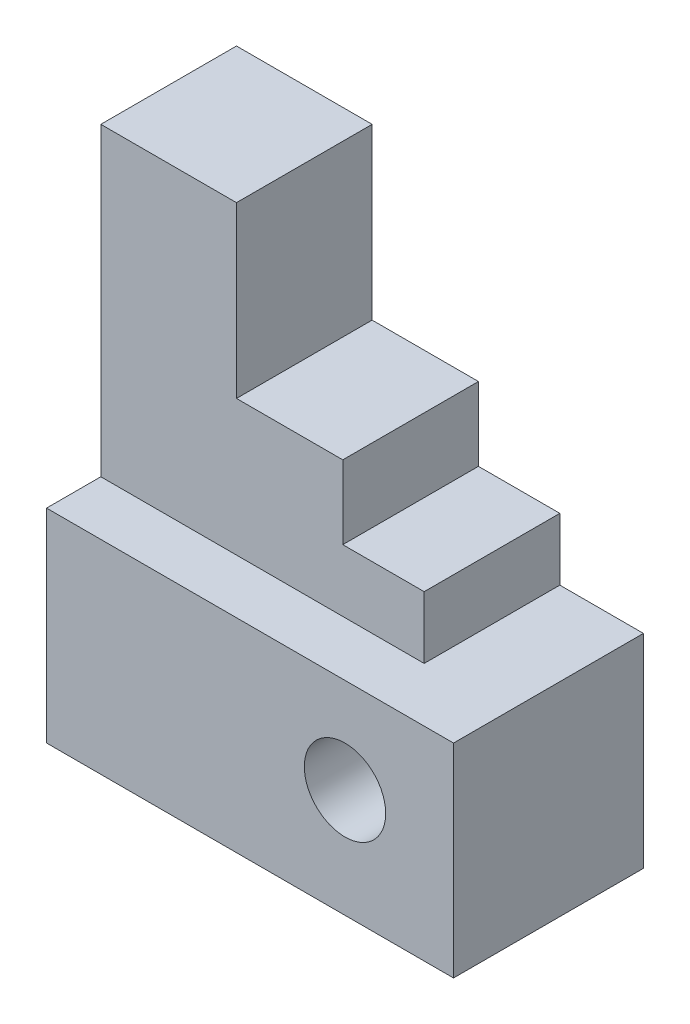
ISO-10303-21;
HEADER;
FILE_DESCRIPTION(('STEP AP214'),'2;1');
FILE_NAME('part.step','',(''),(''),'','','');
FILE_SCHEMA(('AUTOMOTIVE_DESIGN { 1 0 10303 214 1 1 1 1 }'));
ENDSEC;
DATA;
#1=APPLICATION_CONTEXT('core data for automotive mechanical design processes');
#2=APPLICATION_PROTOCOL_DEFINITION('international standard','automotive_design',2000,#1);
#3=PRODUCT_CONTEXT('',#1,'mechanical');
#4=PRODUCT('Part','Part','',(#3));
#5=PRODUCT_RELATED_PRODUCT_CATEGORY('part','',(#4));
#6=PRODUCT_DEFINITION_FORMATION('','',#4);
#7=PRODUCT_DEFINITION_CONTEXT('part definition',#1,'design');
#8=PRODUCT_DEFINITION('design','',#6,#7);
#9=PRODUCT_DEFINITION_SHAPE('','',#8);
#10=(LENGTH_UNIT() NAMED_UNIT(*) SI_UNIT(.MILLI.,.METRE.));
#11=(NAMED_UNIT(*) PLANE_ANGLE_UNIT() SI_UNIT($,.RADIAN.));
#12=(NAMED_UNIT(*) SI_UNIT($,.STERADIAN.) SOLID_ANGLE_UNIT());
#13=UNCERTAINTY_MEASURE_WITH_UNIT(LENGTH_MEASURE(1.E-05),#10,'distance_accuracy_value','');
#14=(GEOMETRIC_REPRESENTATION_CONTEXT(3) GLOBAL_UNCERTAINTY_ASSIGNED_CONTEXT((#13)) GLOBAL_UNIT_ASSIGNED_CONTEXT((#10,
#11,#12)) REPRESENTATION_CONTEXT('',''));
#15=CARTESIAN_POINT('',(0.,0.,0.));
#16=DIRECTION('',(0.,0.,1.));
#17=DIRECTION('',(1.,0.,0.));
#18=AXIS2_PLACEMENT_3D('',#15,#16,#17);
#19=CARTESIAN_POINT('',(0.,0.,28.));
#20=DIRECTION('',(0.,1.,0.));
#21=DIRECTION('',(0.,0.,1.));
#22=AXIS2_PLACEMENT_3D('',#19,#20,#21);
#23=PLANE('',#22);
#24=DIRECTION('',(1.,0.,0.));
#25=VECTOR('',#24,1.);
#26=CARTESIAN_POINT('',(0.,0.,0.));
#27=LINE('',#26,#25);
#28=CARTESIAN_POINT('',(0.,0.,0.));
#29=VERTEX_POINT('',#28);
#30=CARTESIAN_POINT('',(60.,0.,0.));
#31=VERTEX_POINT('',#30);
#32=EDGE_CURVE('E238',#29,#31,#27,.T.);
#33=ORIENTED_EDGE('',*,*,#32,.T.);
#34=DIRECTION('',(0.,0.,-1.));
#35=VECTOR('',#34,1.);
#36=CARTESIAN_POINT('',(60.,0.,28.));
#37=LINE('',#36,#35);
#38=CARTESIAN_POINT('',(60.,0.,28.));
#39=VERTEX_POINT('',#38);
#40=EDGE_CURVE('E11',#39,#31,#37,.T.);
#41=ORIENTED_EDGE('',*,*,#40,.F.);
#42=DIRECTION('',(1.,0.,0.));
#43=VECTOR('',#42,1.);
#44=CARTESIAN_POINT('',(0.,0.,28.));
#45=LINE('',#44,#43);
#46=CARTESIAN_POINT('',(0.,0.,28.));
#47=VERTEX_POINT('',#46);
#48=EDGE_CURVE('E218',#47,#39,#45,.T.);
#49=ORIENTED_EDGE('',*,*,#48,.F.);
#50=DIRECTION('',(0.,0.,-1.));
#51=VECTOR('',#50,1.);
#52=CARTESIAN_POINT('',(0.,0.,28.));
#53=LINE('',#52,#51);
#54=EDGE_CURVE('E234',#47,#29,#53,.T.);
#55=ORIENTED_EDGE('',*,*,#54,.T.);
#56=EDGE_LOOP('',(#33,#41,#49,#55));
#57=FACE_BOUND('',#56,.T.);
#58=ADVANCED_FACE('F45',(#57),#23,.F.);
#59=CARTESIAN_POINT('',(60.,0.,28.));
#60=DIRECTION('',(-1.,0.,0.));
#61=DIRECTION('',(0.,0.,1.));
#62=AXIS2_PLACEMENT_3D('',#59,#60,#61);
#63=PLANE('',#62);
#64=DIRECTION('',(0.,1.,0.));
#65=VECTOR('',#64,1.);
#66=CARTESIAN_POINT('',(60.,0.,0.));
#67=LINE('',#66,#65);
#68=CARTESIAN_POINT('',(60.,30.,0.));
#69=VERTEX_POINT('',#68);
#70=EDGE_CURVE('E242',#31,#69,#67,.T.);
#71=ORIENTED_EDGE('',*,*,#70,.T.);
#72=DIRECTION('',(0.,0.,-1.));
#73=VECTOR('',#72,1.);
#74=CARTESIAN_POINT('',(60.,30.,28.));
#75=LINE('',#74,#73);
#76=CARTESIAN_POINT('',(60.,30.,28.));
#77=VERTEX_POINT('',#76);
#78=EDGE_CURVE('E54',#77,#69,#75,.T.);
#79=ORIENTED_EDGE('',*,*,#78,.F.);
#80=DIRECTION('',(0.,1.,0.));
#81=VECTOR('',#80,1.);
#82=CARTESIAN_POINT('',(60.,0.,28.));
#83=LINE('',#82,#81);
#84=EDGE_CURVE('E223',#39,#77,#83,.T.);
#85=ORIENTED_EDGE('',*,*,#84,.F.);
#86=ORIENTED_EDGE('',*,*,#40,.T.);
#87=EDGE_LOOP('',(#71,#79,#85,#86));
#88=FACE_BOUND('',#87,.T.);
#89=ADVANCED_FACE('F259',(#88),#63,.F.);
#90=CARTESIAN_POINT('',(0.,30.,28.));
#91=DIRECTION('',(0.,1.,0.));
#92=DIRECTION('',(0.,0.,1.));
#93=AXIS2_PLACEMENT_3D('',#90,#91,#92);
#94=PLANE('',#93);
#95=DIRECTION('',(0.,0.,-1.));
#96=VECTOR('',#95,1.);
#97=CARTESIAN_POINT('',(47.6737293262179,30.,20.));
#98=LINE('',#97,#96);
#99=CARTESIAN_POINT('',(47.6737293262179,30.,20.));
#100=VERTEX_POINT('',#99);
#101=CARTESIAN_POINT('',(47.6737293262179,30.,0.));
#102=VERTEX_POINT('',#101);
#103=EDGE_CURVE('E199',#100,#102,#98,.T.);
#104=ORIENTED_EDGE('',*,*,#103,.F.);
#105=DIRECTION('',(1.,0.,0.));
#106=VECTOR('',#105,1.);
#107=CARTESIAN_POINT('',(0.,30.,20.));
#108=LINE('',#107,#106);
#109=CARTESIAN_POINT('',(0.,30.,20.));
#110=VERTEX_POINT('',#109);
#111=EDGE_CURVE('E61',#110,#100,#108,.T.);
#112=ORIENTED_EDGE('',*,*,#111,.F.);
#113=DIRECTION('',(0.,0.,-1.));
#114=VECTOR('',#113,1.);
#115=CARTESIAN_POINT('',(0.,30.,28.));
#116=LINE('',#115,#114);
#117=CARTESIAN_POINT('',(0.,30.,28.));
#118=VERTEX_POINT('',#117);
#119=EDGE_CURVE('E252',#118,#110,#116,.T.);
#120=ORIENTED_EDGE('',*,*,#119,.F.);
#121=DIRECTION('',(1.,0.,0.));
#122=VECTOR('',#121,1.);
#123=CARTESIAN_POINT('',(0.,30.,28.));
#124=LINE('',#123,#122);
#125=EDGE_CURVE('E226',#118,#77,#124,.T.);
#126=ORIENTED_EDGE('',*,*,#125,.T.);
#127=ORIENTED_EDGE('',*,*,#78,.T.);
#128=DIRECTION('',(1.,0.,0.));
#129=VECTOR('',#128,1.);
#130=CARTESIAN_POINT('',(0.,30.,0.));
#131=LINE('',#130,#129);
#132=EDGE_CURVE('E67',#102,#69,#131,.T.);
#133=ORIENTED_EDGE('',*,*,#132,.F.);
#134=EDGE_LOOP('',(#104,#112,#120,#126,#127,#133));
#135=FACE_BOUND('',#134,.T.);
#136=ADVANCED_FACE('F256',(#135),#94,.T.);
#137=CARTESIAN_POINT('',(44.,16.,28.));
#138=DIRECTION('',(0.,0.,-1.));
#139=DIRECTION('',(-1.,0.,0.));
#140=AXIS2_PLACEMENT_3D('',#137,#138,#139);
#141=CYLINDRICAL_SURFACE('',#140,6.);
#142=CARTESIAN_POINT('',(44.,16.,28.));
#143=DIRECTION('',(0.,0.,1.));
#144=DIRECTION('',(1.,0.,0.));
#145=AXIS2_PLACEMENT_3D('',#142,#143,#144);
#146=CIRCLE('',#145,6.);
#147=CARTESIAN_POINT('',(50.,16.,28.));
#148=VERTEX_POINT('',#147);
#149=EDGE_CURVE('E214',#148,#148,#146,.T.);
#150=ORIENTED_EDGE('',*,*,#149,.T.);
#151=EDGE_LOOP('',(#150));
#152=FACE_BOUND('',#151,.T.);
#153=CARTESIAN_POINT('',(44.,16.,0.));
#154=DIRECTION('',(0.,0.,1.));
#155=DIRECTION('',(1.,0.,0.));
#156=AXIS2_PLACEMENT_3D('',#153,#154,#155);
#157=CIRCLE('',#156,6.);
#158=CARTESIAN_POINT('',(50.,16.,0.));
#159=VERTEX_POINT('',#158);
#160=EDGE_CURVE('E139',#159,#159,#157,.T.);
#161=ORIENTED_EDGE('',*,*,#160,.F.);
#162=EDGE_LOOP('',(#161));
#163=FACE_BOUND('',#162,.T.);
#164=ADVANCED_FACE('F47',(#152,#163),#141,.F.);
#165=CARTESIAN_POINT('',(0.,0.,28.));
#166=DIRECTION('',(-1.,0.,0.));
#167=DIRECTION('',(0.,0.,1.));
#168=AXIS2_PLACEMENT_3D('',#165,#166,#167);
#169=PLANE('',#168);
#170=DIRECTION('',(0.,1.,0.));
#171=VECTOR('',#170,1.);
#172=CARTESIAN_POINT('',(0.,0.,0.));
#173=LINE('',#172,#171);
#174=CARTESIAN_POINT('',(0.,75.,0.));
#175=VERTEX_POINT('',#174);
#176=EDGE_CURVE('E219',#29,#175,#173,.T.);
#177=ORIENTED_EDGE('',*,*,#176,.F.);
#178=ORIENTED_EDGE('',*,*,#54,.F.);
#179=DIRECTION('',(0.,1.,0.));
#180=VECTOR('',#179,1.);
#181=CARTESIAN_POINT('',(0.,0.,28.));
#182=LINE('',#181,#180);
#183=EDGE_CURVE('E230',#47,#118,#182,.T.);
#184=ORIENTED_EDGE('',*,*,#183,.T.);
#185=ORIENTED_EDGE('',*,*,#119,.T.);
#186=DIRECTION('',(0.,1.,0.));
#187=VECTOR('',#186,1.);
#188=CARTESIAN_POINT('',(0.,0.,20.));
#189=LINE('',#188,#187);
#190=CARTESIAN_POINT('',(0.,75.,20.));
#191=VERTEX_POINT('',#190);
#192=EDGE_CURVE('E168',#110,#191,#189,.T.);
#193=ORIENTED_EDGE('',*,*,#192,.T.);
#194=DIRECTION('',(0.,0.,-1.));
#195=VECTOR('',#194,1.);
#196=CARTESIAN_POINT('',(0.,75.,20.));
#197=LINE('',#196,#195);
#198=EDGE_CURVE('E202',#191,#175,#197,.T.);
#199=ORIENTED_EDGE('',*,*,#198,.T.);
#200=EDGE_LOOP('',(#177,#178,#184,#185,#193,#199));
#201=FACE_BOUND('',#200,.T.);
#202=ADVANCED_FACE('F271',(#201),#169,.T.);
#203=CARTESIAN_POINT('',(0.,0.,28.));
#204=DIRECTION('',(0.,0.,1.));
#205=DIRECTION('',(1.,0.,0.));
#206=AXIS2_PLACEMENT_3D('',#203,#204,#205);
#207=PLANE('',#206);
#208=ORIENTED_EDGE('',*,*,#149,.F.);
#209=EDGE_LOOP('',(#208));
#210=FACE_BOUND('',#209,.T.);
#211=ORIENTED_EDGE('',*,*,#48,.T.);
#212=ORIENTED_EDGE('',*,*,#84,.T.);
#213=ORIENTED_EDGE('',*,*,#125,.F.);
#214=ORIENTED_EDGE('',*,*,#183,.F.);
#215=EDGE_LOOP('',(#211,#212,#213,#214));
#216=FACE_BOUND('',#215,.T.);
#217=ADVANCED_FACE('F275',(#210,#216),#207,.T.);
#218=CARTESIAN_POINT('',(0.,0.,0.));
#219=DIRECTION('',(0.,0.,1.));
#220=DIRECTION('',(1.,0.,0.));
#221=AXIS2_PLACEMENT_3D('',#218,#219,#220);
#222=PLANE('',#221);
#223=ORIENTED_EDGE('',*,*,#160,.T.);
#224=EDGE_LOOP('',(#223));
#225=FACE_BOUND('',#224,.T.);
#226=ORIENTED_EDGE('',*,*,#32,.F.);
#227=ORIENTED_EDGE('',*,*,#176,.T.);
#228=DIRECTION('',(1.,0.,0.));
#229=VECTOR('',#228,1.);
#230=CARTESIAN_POINT('',(0.,75.,0.));
#231=LINE('',#230,#229);
#232=CARTESIAN_POINT('',(20.,75.,0.));
#233=VERTEX_POINT('',#232);
#234=EDGE_CURVE('E190',#175,#233,#231,.T.);
#235=ORIENTED_EDGE('',*,*,#234,.T.);
#236=DIRECTION('',(0.,1.,0.));
#237=VECTOR('',#236,1.);
#238=CARTESIAN_POINT('',(20.,0.,0.));
#239=LINE('',#238,#237);
#240=CARTESIAN_POINT('',(20.,50.,0.));
#241=VERTEX_POINT('',#240);
#242=EDGE_CURVE('E186',#241,#233,#239,.T.);
#243=ORIENTED_EDGE('',*,*,#242,.F.);
#244=DIRECTION('',(1.,0.,0.));
#245=VECTOR('',#244,1.);
#246=CARTESIAN_POINT('',(0.,50.,0.));
#247=LINE('',#246,#245);
#248=CARTESIAN_POINT('',(35.6737293262179,50.,0.));
#249=VERTEX_POINT('',#248);
#250=EDGE_CURVE('E182',#241,#249,#247,.T.);
#251=ORIENTED_EDGE('',*,*,#250,.T.);
#252=DIRECTION('',(0.,-1.,0.));
#253=VECTOR('',#252,1.);
#254=CARTESIAN_POINT('',(35.6737293262179,0.,0.));
#255=LINE('',#254,#253);
#256=CARTESIAN_POINT('',(35.6737293262179,39.1665833998087,0.));
#257=VERTEX_POINT('',#256);
#258=EDGE_CURVE('E179',#249,#257,#255,.T.);
#259=ORIENTED_EDGE('',*,*,#258,.T.);
#260=DIRECTION('',(1.,0.,0.));
#261=VECTOR('',#260,1.);
#262=CARTESIAN_POINT('',(0.,39.1665833998087,0.));
#263=LINE('',#262,#261);
#264=CARTESIAN_POINT('',(47.6737293262179,39.1665833998087,0.));
#265=VERTEX_POINT('',#264);
#266=EDGE_CURVE('E133',#257,#265,#263,.T.);
#267=ORIENTED_EDGE('',*,*,#266,.T.);
#268=DIRECTION('',(0.,1.,0.));
#269=VECTOR('',#268,1.);
#270=CARTESIAN_POINT('',(47.6737293262179,0.,0.));
#271=LINE('',#270,#269);
#272=EDGE_CURVE('E152',#102,#265,#271,.T.);
#273=ORIENTED_EDGE('',*,*,#272,.F.);
#274=ORIENTED_EDGE('',*,*,#132,.T.);
#275=ORIENTED_EDGE('',*,*,#70,.F.);
#276=EDGE_LOOP('',(#226,#227,#235,#243,#251,#259,#267,#273,#274,#275));
#277=FACE_BOUND('',#276,.T.);
#278=ADVANCED_FACE('F263',(#225,#277),#222,.F.);
#279=CARTESIAN_POINT('',(0.,39.1665833998087,20.));
#280=DIRECTION('',(0.,1.,0.));
#281=DIRECTION('',(0.,0.,1.));
#282=AXIS2_PLACEMENT_3D('',#279,#280,#281);
#283=PLANE('',#282);
#284=ORIENTED_EDGE('',*,*,#266,.F.);
#285=DIRECTION('',(0.,0.,-1.));
#286=VECTOR('',#285,1.);
#287=CARTESIAN_POINT('',(35.6737293262179,39.1665833998087,20.));
#288=LINE('',#287,#286);
#289=CARTESIAN_POINT('',(35.6737293262179,39.1665833998087,20.));
#290=VERTEX_POINT('',#289);
#291=EDGE_CURVE('E128',#290,#257,#288,.T.);
#292=ORIENTED_EDGE('',*,*,#291,.F.);
#293=DIRECTION('',(1.,0.,0.));
#294=VECTOR('',#293,1.);
#295=CARTESIAN_POINT('',(0.,39.1665833998087,20.));
#296=LINE('',#295,#294);
#297=CARTESIAN_POINT('',(47.6737293262179,39.1665833998087,20.));
#298=VERTEX_POINT('',#297);
#299=EDGE_CURVE('E131',#290,#298,#296,.T.);
#300=ORIENTED_EDGE('',*,*,#299,.T.);
#301=DIRECTION('',(0.,0.,-1.));
#302=VECTOR('',#301,1.);
#303=CARTESIAN_POINT('',(47.6737293262179,39.1665833998087,20.));
#304=LINE('',#303,#302);
#305=EDGE_CURVE('E176',#298,#265,#304,.T.);
#306=ORIENTED_EDGE('',*,*,#305,.T.);
#307=EDGE_LOOP('',(#284,#292,#300,#306));
#308=FACE_BOUND('',#307,.T.);
#309=ADVANCED_FACE('F130',(#308),#283,.T.);
#310=CARTESIAN_POINT('',(35.6737293262179,0.,20.));
#311=DIRECTION('',(1.,0.,0.));
#312=DIRECTION('',(0.,0.,-1.));
#313=AXIS2_PLACEMENT_3D('',#310,#311,#312);
#314=PLANE('',#313);
#315=ORIENTED_EDGE('',*,*,#258,.F.);
#316=DIRECTION('',(0.,0.,-1.));
#317=VECTOR('',#316,1.);
#318=CARTESIAN_POINT('',(35.6737293262179,50.,20.));
#319=LINE('',#318,#317);
#320=CARTESIAN_POINT('',(35.6737293262179,50.,20.));
#321=VERTEX_POINT('',#320);
#322=EDGE_CURVE('E140',#321,#249,#319,.T.);
#323=ORIENTED_EDGE('',*,*,#322,.F.);
#324=DIRECTION('',(0.,-1.,0.));
#325=VECTOR('',#324,1.);
#326=CARTESIAN_POINT('',(35.6737293262179,0.,20.));
#327=LINE('',#326,#325);
#328=EDGE_CURVE('E146',#321,#290,#327,.T.);
#329=ORIENTED_EDGE('',*,*,#328,.T.);
#330=ORIENTED_EDGE('',*,*,#291,.T.);
#331=EDGE_LOOP('',(#315,#323,#329,#330));
#332=FACE_BOUND('',#331,.T.);
#333=ADVANCED_FACE('F154',(#332),#314,.T.);
#334=CARTESIAN_POINT('',(0.,50.,20.));
#335=DIRECTION('',(0.,1.,0.));
#336=DIRECTION('',(0.,0.,1.));
#337=AXIS2_PLACEMENT_3D('',#334,#335,#336);
#338=PLANE('',#337);
#339=ORIENTED_EDGE('',*,*,#250,.F.);
#340=DIRECTION('',(0.,0.,-1.));
#341=VECTOR('',#340,1.);
#342=CARTESIAN_POINT('',(20.,50.,20.));
#343=LINE('',#342,#341);
#344=CARTESIAN_POINT('',(20.,50.,20.));
#345=VERTEX_POINT('',#344);
#346=EDGE_CURVE('E209',#345,#241,#343,.T.);
#347=ORIENTED_EDGE('',*,*,#346,.F.);
#348=DIRECTION('',(1.,0.,0.));
#349=VECTOR('',#348,1.);
#350=CARTESIAN_POINT('',(0.,50.,20.));
#351=LINE('',#350,#349);
#352=EDGE_CURVE('E156',#345,#321,#351,.T.);
#353=ORIENTED_EDGE('',*,*,#352,.T.);
#354=ORIENTED_EDGE('',*,*,#322,.T.);
#355=EDGE_LOOP('',(#339,#347,#353,#354));
#356=FACE_BOUND('',#355,.T.);
#357=ADVANCED_FACE('F287',(#356),#338,.T.);
#358=CARTESIAN_POINT('',(20.,0.,20.));
#359=DIRECTION('',(-1.,0.,0.));
#360=DIRECTION('',(0.,0.,1.));
#361=AXIS2_PLACEMENT_3D('',#358,#359,#360);
#362=PLANE('',#361);
#363=ORIENTED_EDGE('',*,*,#242,.T.);
#364=DIRECTION('',(0.,0.,-1.));
#365=VECTOR('',#364,1.);
#366=CARTESIAN_POINT('',(20.,75.,20.));
#367=LINE('',#366,#365);
#368=CARTESIAN_POINT('',(20.,75.,20.));
#369=VERTEX_POINT('',#368);
#370=EDGE_CURVE('E206',#369,#233,#367,.T.);
#371=ORIENTED_EDGE('',*,*,#370,.F.);
#372=DIRECTION('',(0.,1.,0.));
#373=VECTOR('',#372,1.);
#374=CARTESIAN_POINT('',(20.,0.,20.));
#375=LINE('',#374,#373);
#376=EDGE_CURVE('E159',#345,#369,#375,.T.);
#377=ORIENTED_EDGE('',*,*,#376,.F.);
#378=ORIENTED_EDGE('',*,*,#346,.T.);
#379=EDGE_LOOP('',(#363,#371,#377,#378));
#380=FACE_BOUND('',#379,.T.);
#381=ADVANCED_FACE('F285',(#380),#362,.F.);
#382=CARTESIAN_POINT('',(0.,75.,20.));
#383=DIRECTION('',(0.,1.,0.));
#384=DIRECTION('',(0.,0.,1.));
#385=AXIS2_PLACEMENT_3D('',#382,#383,#384);
#386=PLANE('',#385);
#387=ORIENTED_EDGE('',*,*,#234,.F.);
#388=ORIENTED_EDGE('',*,*,#198,.F.);
#389=DIRECTION('',(1.,0.,0.));
#390=VECTOR('',#389,1.);
#391=CARTESIAN_POINT('',(0.,75.,20.));
#392=LINE('',#391,#390);
#393=EDGE_CURVE('E164',#191,#369,#392,.T.);
#394=ORIENTED_EDGE('',*,*,#393,.T.);
#395=ORIENTED_EDGE('',*,*,#370,.T.);
#396=EDGE_LOOP('',(#387,#388,#394,#395));
#397=FACE_BOUND('',#396,.T.);
#398=ADVANCED_FACE('F281',(#397),#386,.T.);
#399=CARTESIAN_POINT('',(47.6737293262179,0.,20.));
#400=DIRECTION('',(-1.,0.,0.));
#401=DIRECTION('',(0.,0.,1.));
#402=AXIS2_PLACEMENT_3D('',#399,#400,#401);
#403=PLANE('',#402);
#404=ORIENTED_EDGE('',*,*,#272,.T.);
#405=ORIENTED_EDGE('',*,*,#305,.F.);
#406=DIRECTION('',(0.,1.,0.));
#407=VECTOR('',#406,1.);
#408=CARTESIAN_POINT('',(47.6737293262179,0.,20.));
#409=LINE('',#408,#407);
#410=EDGE_CURVE('E149',#100,#298,#409,.T.);
#411=ORIENTED_EDGE('',*,*,#410,.F.);
#412=ORIENTED_EDGE('',*,*,#103,.T.);
#413=EDGE_LOOP('',(#404,#405,#411,#412));
#414=FACE_BOUND('',#413,.T.);
#415=ADVANCED_FACE('F267',(#414),#403,.F.);
#416=CARTESIAN_POINT('',(0.,0.,20.));
#417=DIRECTION('',(0.,0.,1.));
#418=DIRECTION('',(1.,0.,0.));
#419=AXIS2_PLACEMENT_3D('',#416,#417,#418);
#420=PLANE('',#419);
#421=ORIENTED_EDGE('',*,*,#299,.F.);
#422=ORIENTED_EDGE('',*,*,#328,.F.);
#423=ORIENTED_EDGE('',*,*,#352,.F.);
#424=ORIENTED_EDGE('',*,*,#376,.T.);
#425=ORIENTED_EDGE('',*,*,#393,.F.);
#426=ORIENTED_EDGE('',*,*,#192,.F.);
#427=ORIENTED_EDGE('',*,*,#111,.T.);
#428=ORIENTED_EDGE('',*,*,#410,.T.);
#429=EDGE_LOOP('',(#421,#422,#423,#424,#425,#426,#427,#428));
#430=FACE_BOUND('',#429,.T.);
#431=ADVANCED_FACE('F144',(#430),#420,.T.);
#432=CLOSED_SHELL('',(#58,#89,#136,#164,#202,#217,#278,#309,#333,#357,#381,#398,#415,#431));
#433=MANIFOLD_SOLID_BREP('B2',#432);
#434=ADVANCED_BREP_SHAPE_REPRESENTATION('',(#18,#433),#14);
#435=SHAPE_DEFINITION_REPRESENTATION(#9,#434);
ENDSEC;
END-ISO-10303-21;
